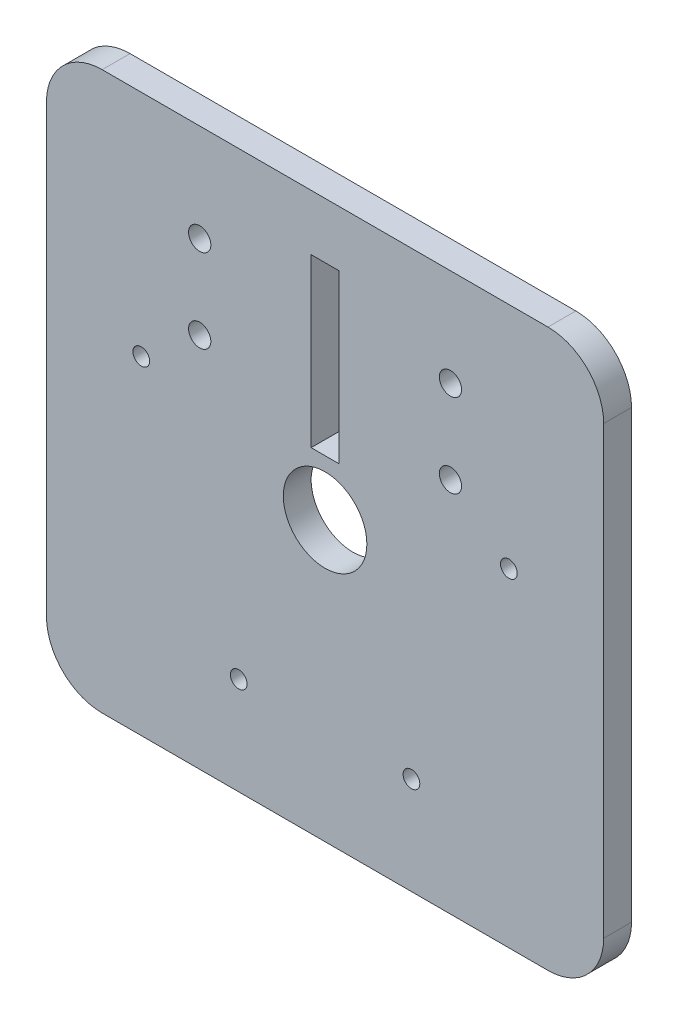
ISO-10303-21;
HEADER;
FILE_DESCRIPTION(('STEP AP214'),'2;1');
FILE_NAME('part.step','',(''),(''),'','','');
FILE_SCHEMA(('AUTOMOTIVE_DESIGN { 1 0 10303 214 1 1 1 1 }'));
ENDSEC;
DATA;
#1=APPLICATION_CONTEXT('core data for automotive mechanical design processes');
#2=APPLICATION_PROTOCOL_DEFINITION('international standard','automotive_design',2000,#1);
#3=PRODUCT_CONTEXT('',#1,'mechanical');
#4=PRODUCT('Part','Part','',(#3));
#5=PRODUCT_RELATED_PRODUCT_CATEGORY('part','',(#4));
#6=PRODUCT_DEFINITION_FORMATION('','',#4);
#7=PRODUCT_DEFINITION_CONTEXT('part definition',#1,'design');
#8=PRODUCT_DEFINITION('design','',#6,#7);
#9=PRODUCT_DEFINITION_SHAPE('','',#8);
#10=(LENGTH_UNIT() NAMED_UNIT(*) SI_UNIT(.MILLI.,.METRE.));
#11=(NAMED_UNIT(*) PLANE_ANGLE_UNIT() SI_UNIT($,.RADIAN.));
#12=(NAMED_UNIT(*) SI_UNIT($,.STERADIAN.) SOLID_ANGLE_UNIT());
#13=UNCERTAINTY_MEASURE_WITH_UNIT(LENGTH_MEASURE(1.E-05),#10,'distance_accuracy_value','');
#14=(GEOMETRIC_REPRESENTATION_CONTEXT(3) GLOBAL_UNCERTAINTY_ASSIGNED_CONTEXT((#13)) GLOBAL_UNIT_ASSIGNED_CONTEXT((#10,
#11,#12)) REPRESENTATION_CONTEXT('',''));
#15=CARTESIAN_POINT('',(0.,0.,0.));
#16=DIRECTION('',(0.,0.,1.));
#17=DIRECTION('',(1.,0.,0.));
#18=AXIS2_PLACEMENT_3D('',#15,#16,#17);
#19=CARTESIAN_POINT('',(0.,0.,5.));
#20=DIRECTION('',(0.,0.,-1.));
#21=DIRECTION('',(-1.,0.,0.));
#22=AXIS2_PLACEMENT_3D('',#19,#20,#21);
#23=PLANE('',#22);
#24=CARTESIAN_POINT('',(-51.2732334160727,-2.68816054430867,5.));
#25=DIRECTION('',(0.,0.,1.));
#26=DIRECTION('',(-1.,0.,0.));
#27=AXIS2_PLACEMENT_3D('',#24,#25,#26);
#28=CIRCLE('',#27,2.);
#29=CARTESIAN_POINT('',(-53.2732334160727,-2.68816054430867,5.));
#30=VERTEX_POINT('',#29);
#31=EDGE_CURVE('E439',#30,#30,#28,.T.);
#32=ORIENTED_EDGE('',*,*,#31,.F.);
#33=EDGE_LOOP('',(#32));
#34=FACE_BOUND('',#33,.T.);
#35=CARTESIAN_POINT('',(-96.2732334160727,-2.68816054430866,5.));
#36=DIRECTION('',(0.,0.,1.));
#37=DIRECTION('',(1.,0.,0.));
#38=AXIS2_PLACEMENT_3D('',#35,#36,#37);
#39=CIRCLE('',#38,2.);
#40=CARTESIAN_POINT('',(-94.2732334160727,-2.68816054430866,5.));
#41=VERTEX_POINT('',#40);
#42=EDGE_CURVE('E445',#41,#41,#39,.T.);
#43=ORIENTED_EDGE('',*,*,#42,.F.);
#44=EDGE_LOOP('',(#43));
#45=FACE_BOUND('',#44,.T.);
#46=CARTESIAN_POINT('',(-96.2732334160727,12.3118394556913,5.));
#47=DIRECTION('',(0.,0.,1.));
#48=DIRECTION('',(-1.,0.,0.));
#49=AXIS2_PLACEMENT_3D('',#46,#47,#48);
#50=CIRCLE('',#49,2.);
#51=CARTESIAN_POINT('',(-98.2732334160727,12.3118394556913,5.));
#52=VERTEX_POINT('',#51);
#53=EDGE_CURVE('E434',#52,#52,#50,.T.);
#54=ORIENTED_EDGE('',*,*,#53,.F.);
#55=EDGE_LOOP('',(#54));
#56=FACE_BOUND('',#55,.T.);
#57=CARTESIAN_POINT('',(-51.2732334160727,12.3118394556913,5.));
#58=DIRECTION('',(0.,0.,1.));
#59=DIRECTION('',(1.,0.,0.));
#60=AXIS2_PLACEMENT_3D('',#57,#58,#59);
#61=CIRCLE('',#60,2.);
#62=CARTESIAN_POINT('',(-49.2732334160727,12.3118394556913,5.));
#63=VERTEX_POINT('',#62);
#64=EDGE_CURVE('E424',#63,#63,#61,.T.);
#65=ORIENTED_EDGE('',*,*,#64,.F.);
#66=EDGE_LOOP('',(#65));
#67=FACE_BOUND('',#66,.T.);
#68=CARTESIAN_POINT('',(-106.757827557717,-11.2516476324012,5.));
#69=DIRECTION('',(0.,0.,-1.));
#70=DIRECTION('',(-1.,0.,0.));
#71=AXIS2_PLACEMENT_3D('',#68,#69,#70);
#72=CIRCLE('',#71,1.5);
#73=CARTESIAN_POINT('',(-108.257827557717,-11.2516476324012,5.));
#74=VERTEX_POINT('',#73);
#75=EDGE_CURVE('E414',#74,#74,#72,.F.);
#76=ORIENTED_EDGE('',*,*,#75,.F.);
#77=EDGE_LOOP('',(#76));
#78=FACE_BOUND('',#77,.T.);
#79=CARTESIAN_POINT('',(-58.2732333952189,-52.6881610045472,5.));
#80=DIRECTION('',(0.,0.,-1.));
#81=DIRECTION('',(-1.,0.,0.));
#82=AXIS2_PLACEMENT_3D('',#79,#80,#81);
#83=CIRCLE('',#82,1.5);
#84=CARTESIAN_POINT('',(-59.7732333952189,-52.6881610045472,5.));
#85=VERTEX_POINT('',#84);
#86=EDGE_CURVE('E407',#85,#85,#83,.F.);
#87=ORIENTED_EDGE('',*,*,#86,.F.);
#88=EDGE_LOOP('',(#87));
#89=FACE_BOUND('',#88,.T.);
#90=CARTESIAN_POINT('',(-89.2732333952189,-52.6881610045472,5.));
#91=DIRECTION('',(0.,0.,-1.));
#92=DIRECTION('',(-1.,0.,0.));
#93=AXIS2_PLACEMENT_3D('',#90,#91,#92);
#94=CIRCLE('',#93,1.5);
#95=CARTESIAN_POINT('',(-90.7732333952189,-52.6881610045472,5.));
#96=VERTEX_POINT('',#95);
#97=EDGE_CURVE('E399',#96,#96,#94,.F.);
#98=ORIENTED_EDGE('',*,*,#97,.F.);
#99=EDGE_LOOP('',(#98));
#100=FACE_BOUND('',#99,.T.);
#101=CARTESIAN_POINT('',(-40.7886392327205,-11.2516476324012,5.));
#102=DIRECTION('',(0.,0.,-1.));
#103=DIRECTION('',(-1.,0.,0.));
#104=AXIS2_PLACEMENT_3D('',#101,#102,#103);
#105=CIRCLE('',#104,1.50000000627285);
#106=CARTESIAN_POINT('',(-42.2886392389934,-11.2516476324012,5.));
#107=VERTEX_POINT('',#106);
#108=EDGE_CURVE('E394',#107,#107,#105,.F.);
#109=ORIENTED_EDGE('',*,*,#108,.F.);
#110=EDGE_LOOP('',(#109));
#111=FACE_BOUND('',#110,.T.);
#112=DIRECTION('',(1.,0.,0.));
#113=VECTOR('',#112,1.);
#114=CARTESIAN_POINT('',(-123.773233416073,-70.1881605443087,5.));
#115=LINE('',#114,#113);
#116=CARTESIAN_POINT('',(-113.773233416073,-70.1881605443087,5.));
#117=VERTEX_POINT('',#116);
#118=CARTESIAN_POINT('',(-33.7732334160727,-70.1881605443087,5.));
#119=VERTEX_POINT('',#118);
#120=EDGE_CURVE('E174',#117,#119,#115,.T.);
#121=ORIENTED_EDGE('',*,*,#120,.T.);
#122=CARTESIAN_POINT('',(-33.7732334160727,-60.1881605443087,5.));
#123=DIRECTION('',(0.,0.,-1.));
#124=DIRECTION('',(-1.,0.,0.));
#125=AXIS2_PLACEMENT_3D('',#122,#123,#124);
#126=CIRCLE('',#125,10.);
#127=CARTESIAN_POINT('',(-23.7732334160727,-60.1881605443087,5.));
#128=VERTEX_POINT('',#127);
#129=EDGE_CURVE('E212',#119,#128,#126,.F.);
#130=ORIENTED_EDGE('',*,*,#129,.T.);
#131=DIRECTION('',(0.,1.,0.));
#132=VECTOR('',#131,1.);
#133=CARTESIAN_POINT('',(-23.7732334160727,29.8118394556913,5.));
#134=LINE('',#133,#132);
#135=CARTESIAN_POINT('',(-23.7732334160727,19.8118394556913,5.));
#136=VERTEX_POINT('',#135);
#137=EDGE_CURVE('E177',#128,#136,#134,.T.);
#138=ORIENTED_EDGE('',*,*,#137,.T.);
#139=CARTESIAN_POINT('',(-33.7732334160727,19.8118394556913,5.));
#140=DIRECTION('',(0.,0.,-1.));
#141=DIRECTION('',(-1.,0.,0.));
#142=AXIS2_PLACEMENT_3D('',#139,#140,#141);
#143=CIRCLE('',#142,10.);
#144=CARTESIAN_POINT('',(-33.7732334160727,29.8118394556913,5.));
#145=VERTEX_POINT('',#144);
#146=EDGE_CURVE('E208',#136,#145,#143,.F.);
#147=ORIENTED_EDGE('',*,*,#146,.T.);
#148=DIRECTION('',(-1.,0.,0.));
#149=VECTOR('',#148,1.);
#150=CARTESIAN_POINT('',(-123.773233416073,29.8118394556913,5.));
#151=LINE('',#150,#149);
#152=CARTESIAN_POINT('',(-113.773233416073,29.8118394556913,5.));
#153=VERTEX_POINT('',#152);
#154=EDGE_CURVE('E169',#145,#153,#151,.T.);
#155=ORIENTED_EDGE('',*,*,#154,.T.);
#156=CARTESIAN_POINT('',(-113.773233416073,19.8118394556913,5.));
#157=DIRECTION('',(0.,0.,-1.));
#158=DIRECTION('',(-1.,0.,0.));
#159=AXIS2_PLACEMENT_3D('',#156,#157,#158);
#160=CIRCLE('',#159,10.);
#161=CARTESIAN_POINT('',(-123.773233416073,19.8118394556913,5.));
#162=VERTEX_POINT('',#161);
#163=EDGE_CURVE('E55',#153,#162,#160,.F.);
#164=ORIENTED_EDGE('',*,*,#163,.T.);
#165=DIRECTION('',(0.,-1.,0.));
#166=VECTOR('',#165,1.);
#167=CARTESIAN_POINT('',(-123.773233416073,29.8118394556913,5.));
#168=LINE('',#167,#166);
#169=CARTESIAN_POINT('',(-123.773233416073,-60.1881605443087,5.));
#170=VERTEX_POINT('',#169);
#171=EDGE_CURVE('E171',#162,#170,#168,.T.);
#172=ORIENTED_EDGE('',*,*,#171,.T.);
#173=CARTESIAN_POINT('',(-113.773233416073,-60.1881605443087,5.));
#174=DIRECTION('',(0.,0.,-1.));
#175=DIRECTION('',(-1.,0.,0.));
#176=AXIS2_PLACEMENT_3D('',#173,#174,#175);
#177=CIRCLE('',#176,10.);
#178=EDGE_CURVE('E210',#170,#117,#177,.F.);
#179=ORIENTED_EDGE('',*,*,#178,.T.);
#180=EDGE_LOOP('',(#121,#130,#138,#147,#155,#164,#172,#179));
#181=FACE_BOUND('',#180,.T.);
#182=DIRECTION('',(0.,-1.,0.));
#183=VECTOR('',#182,1.);
#184=CARTESIAN_POINT('',(-76.2732334160727,19.8118394556913,5.));
#185=LINE('',#184,#183);
#186=CARTESIAN_POINT('',(-76.2732334160727,19.8118394556913,5.));
#187=VERTEX_POINT('',#186);
#188=CARTESIAN_POINT('',(-76.2732334160727,-10.1881605443087,5.));
#189=VERTEX_POINT('',#188);
#190=EDGE_CURVE('E125',#187,#189,#185,.T.);
#191=ORIENTED_EDGE('',*,*,#190,.F.);
#192=DIRECTION('',(-1.,0.,0.));
#193=VECTOR('',#192,1.);
#194=CARTESIAN_POINT('',(-76.2732334160727,19.8118394556913,5.));
#195=LINE('',#194,#193);
#196=CARTESIAN_POINT('',(-71.2732334160727,19.8118394556913,5.));
#197=VERTEX_POINT('',#196);
#198=EDGE_CURVE('E151',#197,#187,#195,.T.);
#199=ORIENTED_EDGE('',*,*,#198,.F.);
#200=DIRECTION('',(0.,1.,0.));
#201=VECTOR('',#200,1.);
#202=CARTESIAN_POINT('',(-71.2732334160727,19.8118394556913,5.));
#203=LINE('',#202,#201);
#204=CARTESIAN_POINT('',(-71.2732334160727,-10.1881605443087,5.));
#205=VERTEX_POINT('',#204);
#206=EDGE_CURVE('E149',#205,#197,#203,.T.);
#207=ORIENTED_EDGE('',*,*,#206,.F.);
#208=DIRECTION('',(1.,0.,0.));
#209=VECTOR('',#208,1.);
#210=CARTESIAN_POINT('',(-76.2732334160727,-10.1881605443087,5.));
#211=LINE('',#210,#209);
#212=EDGE_CURVE('E135',#189,#205,#211,.T.);
#213=ORIENTED_EDGE('',*,*,#212,.F.);
#214=EDGE_LOOP('',(#191,#199,#207,#213));
#215=FACE_BOUND('',#214,.T.);
#216=CARTESIAN_POINT('',(-73.7732334160727,-20.1881605443087,5.));
#217=DIRECTION('',(0.,0.,1.));
#218=DIRECTION('',(1.,0.,0.));
#219=AXIS2_PLACEMENT_3D('',#216,#217,#218);
#220=CIRCLE('',#219,7.50000000000001);
#221=CARTESIAN_POINT('',(-66.2732334160727,-20.1881605443087,5.));
#222=VERTEX_POINT('',#221);
#223=EDGE_CURVE('E158',#222,#222,#220,.T.);
#224=ORIENTED_EDGE('',*,*,#223,.F.);
#225=EDGE_LOOP('',(#224));
#226=FACE_BOUND('',#225,.T.);
#227=ADVANCED_FACE('F33',(#34,#45,#56,#67,#78,#89,#100,#111,#181,#215,#226),#23,.F.);
#228=CARTESIAN_POINT('',(0.,0.,0.));
#229=DIRECTION('',(0.,0.,-1.));
#230=DIRECTION('',(-1.,0.,0.));
#231=AXIS2_PLACEMENT_3D('',#228,#229,#230);
#232=PLANE('',#231);
#233=CARTESIAN_POINT('',(-51.2732334160727,-2.68816054430867,0.));
#234=DIRECTION('',(0.,0.,-1.));
#235=DIRECTION('',(-1.,0.,0.));
#236=AXIS2_PLACEMENT_3D('',#233,#234,#235);
#237=CIRCLE('',#236,2.);
#238=CARTESIAN_POINT('',(-53.2732334160727,-2.68816054430867,0.));
#239=VERTEX_POINT('',#238);
#240=EDGE_CURVE('E436',#239,#239,#237,.F.);
#241=ORIENTED_EDGE('',*,*,#240,.T.);
#242=EDGE_LOOP('',(#241));
#243=FACE_BOUND('',#242,.T.);
#244=CARTESIAN_POINT('',(-96.2732334160727,-2.68816054430866,0.));
#245=DIRECTION('',(0.,0.,-1.));
#246=DIRECTION('',(-1.,0.,0.));
#247=AXIS2_PLACEMENT_3D('',#244,#245,#246);
#248=CIRCLE('',#247,2.);
#249=CARTESIAN_POINT('',(-98.2732334160727,-2.68816054430866,0.));
#250=VERTEX_POINT('',#249);
#251=EDGE_CURVE('E442',#250,#250,#248,.F.);
#252=ORIENTED_EDGE('',*,*,#251,.T.);
#253=EDGE_LOOP('',(#252));
#254=FACE_BOUND('',#253,.T.);
#255=CARTESIAN_POINT('',(-96.2732334160727,12.3118394556913,0.));
#256=DIRECTION('',(0.,0.,-1.));
#257=DIRECTION('',(-1.,0.,0.));
#258=AXIS2_PLACEMENT_3D('',#255,#256,#257);
#259=CIRCLE('',#258,2.);
#260=CARTESIAN_POINT('',(-98.2732334160727,12.3118394556913,0.));
#261=VERTEX_POINT('',#260);
#262=EDGE_CURVE('E448',#261,#261,#259,.F.);
#263=ORIENTED_EDGE('',*,*,#262,.T.);
#264=EDGE_LOOP('',(#263));
#265=FACE_BOUND('',#264,.T.);
#266=CARTESIAN_POINT('',(-51.2732334160727,12.3118394556913,0.));
#267=DIRECTION('',(0.,0.,-1.));
#268=DIRECTION('',(-1.,0.,0.));
#269=AXIS2_PLACEMENT_3D('',#266,#267,#268);
#270=CIRCLE('',#269,2.);
#271=CARTESIAN_POINT('',(-53.2732334160727,12.3118394556913,0.));
#272=VERTEX_POINT('',#271);
#273=EDGE_CURVE('E429',#272,#272,#270,.F.);
#274=ORIENTED_EDGE('',*,*,#273,.T.);
#275=EDGE_LOOP('',(#274));
#276=FACE_BOUND('',#275,.T.);
#277=CARTESIAN_POINT('',(-106.757827557717,-11.2516476324012,0.));
#278=DIRECTION('',(0.,0.,-1.));
#279=DIRECTION('',(-1.,0.,0.));
#280=AXIS2_PLACEMENT_3D('',#277,#278,#279);
#281=CIRCLE('',#280,1.5);
#282=CARTESIAN_POINT('',(-108.257827557717,-11.2516476324012,0.));
#283=VERTEX_POINT('',#282);
#284=EDGE_CURVE('E401',#283,#283,#281,.T.);
#285=ORIENTED_EDGE('',*,*,#284,.F.);
#286=EDGE_LOOP('',(#285));
#287=FACE_BOUND('',#286,.T.);
#288=CARTESIAN_POINT('',(-58.2732333952189,-52.6881610045472,0.));
#289=DIRECTION('',(0.,0.,-1.));
#290=DIRECTION('',(-1.,0.,0.));
#291=AXIS2_PLACEMENT_3D('',#288,#289,#290);
#292=CIRCLE('',#291,1.5);
#293=CARTESIAN_POINT('',(-59.7732333952189,-52.6881610045472,0.));
#294=VERTEX_POINT('',#293);
#295=EDGE_CURVE('E422',#294,#294,#292,.T.);
#296=ORIENTED_EDGE('',*,*,#295,.F.);
#297=EDGE_LOOP('',(#296));
#298=FACE_BOUND('',#297,.T.);
#299=CARTESIAN_POINT('',(-89.2732333952189,-52.6881610045472,0.));
#300=DIRECTION('',(0.,0.,-1.));
#301=DIRECTION('',(-1.,0.,0.));
#302=AXIS2_PLACEMENT_3D('',#299,#300,#301);
#303=CIRCLE('',#302,1.5);
#304=CARTESIAN_POINT('',(-90.7732333952189,-52.6881610045472,0.));
#305=VERTEX_POINT('',#304);
#306=EDGE_CURVE('E404',#305,#305,#303,.T.);
#307=ORIENTED_EDGE('',*,*,#306,.F.);
#308=EDGE_LOOP('',(#307));
#309=FACE_BOUND('',#308,.T.);
#310=CARTESIAN_POINT('',(-40.7886392327205,-11.2516476324012,0.));
#311=DIRECTION('',(0.,0.,-1.));
#312=DIRECTION('',(-1.,0.,0.));
#313=AXIS2_PLACEMENT_3D('',#310,#311,#312);
#314=CIRCLE('',#313,1.50000000627285);
#315=CARTESIAN_POINT('',(-42.2886392389934,-11.2516476324012,0.));
#316=VERTEX_POINT('',#315);
#317=EDGE_CURVE('E397',#316,#316,#314,.T.);
#318=ORIENTED_EDGE('',*,*,#317,.F.);
#319=EDGE_LOOP('',(#318));
#320=FACE_BOUND('',#319,.T.);
#321=DIRECTION('',(-1.,0.,0.));
#322=VECTOR('',#321,1.);
#323=CARTESIAN_POINT('',(-76.2732334160727,19.8118394556913,0.));
#324=LINE('',#323,#322);
#325=CARTESIAN_POINT('',(-71.2732334160727,19.8118394556913,0.));
#326=VERTEX_POINT('',#325);
#327=CARTESIAN_POINT('',(-76.2732334160727,19.8118394556913,0.));
#328=VERTEX_POINT('',#327);
#329=EDGE_CURVE('E136',#326,#328,#324,.T.);
#330=ORIENTED_EDGE('',*,*,#329,.T.);
#331=DIRECTION('',(0.,-1.,0.));
#332=VECTOR('',#331,1.);
#333=CARTESIAN_POINT('',(-76.2732334160727,19.8118394556913,0.));
#334=LINE('',#333,#332);
#335=CARTESIAN_POINT('',(-76.2732334160727,-10.1881605443087,0.));
#336=VERTEX_POINT('',#335);
#337=EDGE_CURVE('E156',#328,#336,#334,.T.);
#338=ORIENTED_EDGE('',*,*,#337,.T.);
#339=DIRECTION('',(1.,0.,0.));
#340=VECTOR('',#339,1.);
#341=CARTESIAN_POINT('',(-76.2732334160727,-10.1881605443087,0.));
#342=LINE('',#341,#340);
#343=CARTESIAN_POINT('',(-71.2732334160727,-10.1881605443087,0.));
#344=VERTEX_POINT('',#343);
#345=EDGE_CURVE('E142',#336,#344,#342,.T.);
#346=ORIENTED_EDGE('',*,*,#345,.T.);
#347=DIRECTION('',(0.,1.,0.));
#348=VECTOR('',#347,1.);
#349=CARTESIAN_POINT('',(-71.2732334160727,19.8118394556913,0.));
#350=LINE('',#349,#348);
#351=EDGE_CURVE('E160',#344,#326,#350,.T.);
#352=ORIENTED_EDGE('',*,*,#351,.T.);
#353=EDGE_LOOP('',(#330,#338,#346,#352));
#354=FACE_BOUND('',#353,.T.);
#355=DIRECTION('',(0.,1.,0.));
#356=VECTOR('',#355,1.);
#357=CARTESIAN_POINT('',(-23.7732334160727,29.8118394556913,0.));
#358=LINE('',#357,#356);
#359=CARTESIAN_POINT('',(-23.7732334160727,-60.1881605443087,0.));
#360=VERTEX_POINT('',#359);
#361=CARTESIAN_POINT('',(-23.7732334160727,19.8118394556913,0.));
#362=VERTEX_POINT('',#361);
#363=EDGE_CURVE('E172',#360,#362,#358,.T.);
#364=ORIENTED_EDGE('',*,*,#363,.F.);
#365=CARTESIAN_POINT('',(-33.7732334160727,-60.1881605443087,0.));
#366=DIRECTION('',(0.,0.,-1.));
#367=DIRECTION('',(-1.,0.,0.));
#368=AXIS2_PLACEMENT_3D('',#365,#366,#367);
#369=CIRCLE('',#368,10.);
#370=CARTESIAN_POINT('',(-33.7732334160727,-70.1881605443087,0.));
#371=VERTEX_POINT('',#370);
#372=EDGE_CURVE('E200',#360,#371,#369,.T.);
#373=ORIENTED_EDGE('',*,*,#372,.T.);
#374=DIRECTION('',(1.,0.,0.));
#375=VECTOR('',#374,1.);
#376=CARTESIAN_POINT('',(-123.773233416073,-70.1881605443087,0.));
#377=LINE('',#376,#375);
#378=CARTESIAN_POINT('',(-113.773233416073,-70.1881605443087,0.));
#379=VERTEX_POINT('',#378);
#380=EDGE_CURVE('E185',#379,#371,#377,.T.);
#381=ORIENTED_EDGE('',*,*,#380,.F.);
#382=CARTESIAN_POINT('',(-113.773233416073,-60.1881605443087,0.));
#383=DIRECTION('',(0.,0.,-1.));
#384=DIRECTION('',(-1.,0.,0.));
#385=AXIS2_PLACEMENT_3D('',#382,#383,#384);
#386=CIRCLE('',#385,10.);
#387=CARTESIAN_POINT('',(-123.773233416073,-60.1881605443087,0.));
#388=VERTEX_POINT('',#387);
#389=EDGE_CURVE('E198',#379,#388,#386,.T.);
#390=ORIENTED_EDGE('',*,*,#389,.T.);
#391=DIRECTION('',(0.,-1.,0.));
#392=VECTOR('',#391,1.);
#393=CARTESIAN_POINT('',(-123.773233416073,29.8118394556913,0.));
#394=LINE('',#393,#392);
#395=CARTESIAN_POINT('',(-123.773233416073,19.8118394556913,0.));
#396=VERTEX_POINT('',#395);
#397=EDGE_CURVE('E183',#396,#388,#394,.T.);
#398=ORIENTED_EDGE('',*,*,#397,.F.);
#399=CARTESIAN_POINT('',(-113.773233416073,19.8118394556913,0.));
#400=DIRECTION('',(0.,0.,-1.));
#401=DIRECTION('',(-1.,0.,0.));
#402=AXIS2_PLACEMENT_3D('',#399,#400,#401);
#403=CIRCLE('',#402,10.);
#404=CARTESIAN_POINT('',(-113.773233416073,29.8118394556913,0.));
#405=VERTEX_POINT('',#404);
#406=EDGE_CURVE('E194',#396,#405,#403,.T.);
#407=ORIENTED_EDGE('',*,*,#406,.T.);
#408=DIRECTION('',(-1.,0.,0.));
#409=VECTOR('',#408,1.);
#410=CARTESIAN_POINT('',(-123.773233416073,29.8118394556913,0.));
#411=LINE('',#410,#409);
#412=CARTESIAN_POINT('',(-33.7732334160727,29.8118394556913,0.));
#413=VERTEX_POINT('',#412);
#414=EDGE_CURVE('E143',#413,#405,#411,.T.);
#415=ORIENTED_EDGE('',*,*,#414,.F.);
#416=CARTESIAN_POINT('',(-33.7732334160727,19.8118394556913,0.));
#417=DIRECTION('',(0.,0.,-1.));
#418=DIRECTION('',(-1.,0.,0.));
#419=AXIS2_PLACEMENT_3D('',#416,#417,#418);
#420=CIRCLE('',#419,10.);
#421=EDGE_CURVE('E196',#413,#362,#420,.T.);
#422=ORIENTED_EDGE('',*,*,#421,.T.);
#423=EDGE_LOOP('',(#364,#373,#381,#390,#398,#407,#415,#422));
#424=FACE_BOUND('',#423,.T.);
#425=CARTESIAN_POINT('',(-73.7732334160727,-20.1881605443087,0.));
#426=DIRECTION('',(0.,0.,1.));
#427=DIRECTION('',(1.,0.,0.));
#428=AXIS2_PLACEMENT_3D('',#425,#426,#427);
#429=CIRCLE('',#428,7.50000000000001);
#430=CARTESIAN_POINT('',(-66.2732334160727,-20.1881605443087,0.));
#431=VERTEX_POINT('',#430);
#432=EDGE_CURVE('E412',#431,#431,#429,.T.);
#433=ORIENTED_EDGE('',*,*,#432,.T.);
#434=EDGE_LOOP('',(#433));
#435=FACE_BOUND('',#434,.T.);
#436=ADVANCED_FACE('F230',(#243,#254,#265,#276,#287,#298,#309,#320,#354,#424,#435),#232,.T.);
#437=CARTESIAN_POINT('',(-123.773233416073,29.8118394556913,5.));
#438=DIRECTION('',(0.,-1.,0.));
#439=DIRECTION('',(1.,0.,0.));
#440=AXIS2_PLACEMENT_3D('',#437,#438,#439);
#441=PLANE('',#440);
#442=ORIENTED_EDGE('',*,*,#154,.F.);
#443=DIRECTION('',(0.,0.,-1.));
#444=VECTOR('',#443,1.);
#445=CARTESIAN_POINT('',(-33.7732334160727,29.8118394556913,5.));
#446=LINE('',#445,#444);
#447=EDGE_CURVE('E11',#145,#413,#446,.T.);
#448=ORIENTED_EDGE('',*,*,#447,.T.);
#449=ORIENTED_EDGE('',*,*,#414,.T.);
#450=DIRECTION('',(0.,0.,-1.));
#451=VECTOR('',#450,1.);
#452=CARTESIAN_POINT('',(-113.773233416073,29.8118394556913,5.));
#453=LINE('',#452,#451);
#454=EDGE_CURVE('E41',#405,#153,#453,.F.);
#455=ORIENTED_EDGE('',*,*,#454,.T.);
#456=EDGE_LOOP('',(#442,#448,#449,#455));
#457=FACE_BOUND('',#456,.T.);
#458=ADVANCED_FACE('F220',(#457),#441,.F.);
#459=CARTESIAN_POINT('',(-123.773233416073,29.8118394556913,5.));
#460=DIRECTION('',(1.,0.,0.));
#461=DIRECTION('',(0.,0.,-1.));
#462=AXIS2_PLACEMENT_3D('',#459,#460,#461);
#463=PLANE('',#462);
#464=ORIENTED_EDGE('',*,*,#397,.T.);
#465=DIRECTION('',(0.,0.,-1.));
#466=VECTOR('',#465,1.);
#467=CARTESIAN_POINT('',(-123.773233416073,-60.1881605443087,5.));
#468=LINE('',#467,#466);
#469=EDGE_CURVE('E48',#388,#170,#468,.F.);
#470=ORIENTED_EDGE('',*,*,#469,.T.);
#471=ORIENTED_EDGE('',*,*,#171,.F.);
#472=DIRECTION('',(0.,0.,-1.));
#473=VECTOR('',#472,1.);
#474=CARTESIAN_POINT('',(-123.773233416073,19.8118394556913,5.));
#475=LINE('',#474,#473);
#476=EDGE_CURVE('E214',#162,#396,#475,.T.);
#477=ORIENTED_EDGE('',*,*,#476,.T.);
#478=EDGE_LOOP('',(#464,#470,#471,#477));
#479=FACE_BOUND('',#478,.T.);
#480=ADVANCED_FACE('F227',(#479),#463,.F.);
#481=CARTESIAN_POINT('',(-123.773233416073,-70.1881605443087,5.));
#482=DIRECTION('',(0.,1.,0.));
#483=DIRECTION('',(-1.,0.,0.));
#484=AXIS2_PLACEMENT_3D('',#481,#482,#483);
#485=PLANE('',#484);
#486=ORIENTED_EDGE('',*,*,#380,.T.);
#487=DIRECTION('',(0.,0.,-1.));
#488=VECTOR('',#487,1.);
#489=CARTESIAN_POINT('',(-33.7732334160727,-70.1881605443087,5.));
#490=LINE('',#489,#488);
#491=EDGE_CURVE('E205',#371,#119,#490,.F.);
#492=ORIENTED_EDGE('',*,*,#491,.T.);
#493=ORIENTED_EDGE('',*,*,#120,.F.);
#494=DIRECTION('',(0.,0.,-1.));
#495=VECTOR('',#494,1.);
#496=CARTESIAN_POINT('',(-113.773233416073,-70.1881605443087,5.));
#497=LINE('',#496,#495);
#498=EDGE_CURVE('E202',#117,#379,#497,.T.);
#499=ORIENTED_EDGE('',*,*,#498,.T.);
#500=EDGE_LOOP('',(#486,#492,#493,#499));
#501=FACE_BOUND('',#500,.T.);
#502=ADVANCED_FACE('F239',(#501),#485,.F.);
#503=CARTESIAN_POINT('',(-23.7732334160727,29.8118394556913,5.));
#504=DIRECTION('',(-1.,0.,0.));
#505=DIRECTION('',(0.,-1.,0.));
#506=AXIS2_PLACEMENT_3D('',#503,#504,#505);
#507=PLANE('',#506);
#508=ORIENTED_EDGE('',*,*,#137,.F.);
#509=DIRECTION('',(0.,0.,-1.));
#510=VECTOR('',#509,1.);
#511=CARTESIAN_POINT('',(-23.7732334160727,-60.1881605443087,5.));
#512=LINE('',#511,#510);
#513=EDGE_CURVE('E191',#128,#360,#512,.T.);
#514=ORIENTED_EDGE('',*,*,#513,.T.);
#515=ORIENTED_EDGE('',*,*,#363,.T.);
#516=DIRECTION('',(0.,0.,-1.));
#517=VECTOR('',#516,1.);
#518=CARTESIAN_POINT('',(-23.7732334160727,19.8118394556913,5.));
#519=LINE('',#518,#517);
#520=EDGE_CURVE('E180',#362,#136,#519,.F.);
#521=ORIENTED_EDGE('',*,*,#520,.T.);
#522=EDGE_LOOP('',(#508,#514,#515,#521));
#523=FACE_BOUND('',#522,.T.);
#524=ADVANCED_FACE('F247',(#523),#507,.F.);
#525=CARTESIAN_POINT('',(-76.2732334160727,19.8118394556913,5.));
#526=DIRECTION('',(1.,0.,0.));
#527=DIRECTION('',(0.,0.,-1.));
#528=AXIS2_PLACEMENT_3D('',#525,#526,#527);
#529=PLANE('',#528);
#530=ORIENTED_EDGE('',*,*,#337,.F.);
#531=DIRECTION('',(0.,0.,-1.));
#532=VECTOR('',#531,1.);
#533=CARTESIAN_POINT('',(-76.2732334160727,19.8118394556913,5.));
#534=LINE('',#533,#532);
#535=EDGE_CURVE('E131',#187,#328,#534,.T.);
#536=ORIENTED_EDGE('',*,*,#535,.F.);
#537=ORIENTED_EDGE('',*,*,#190,.T.);
#538=DIRECTION('',(0.,0.,-1.));
#539=VECTOR('',#538,1.);
#540=CARTESIAN_POINT('',(-76.2732334160727,-10.1881605443087,5.));
#541=LINE('',#540,#539);
#542=EDGE_CURVE('E128',#189,#336,#541,.T.);
#543=ORIENTED_EDGE('',*,*,#542,.T.);
#544=EDGE_LOOP('',(#530,#536,#537,#543));
#545=FACE_BOUND('',#544,.T.);
#546=ADVANCED_FACE('F127',(#545),#529,.T.);
#547=CARTESIAN_POINT('',(-76.2732334160727,-10.1881605443087,5.));
#548=DIRECTION('',(0.,1.,0.));
#549=DIRECTION('',(0.,0.,1.));
#550=AXIS2_PLACEMENT_3D('',#547,#548,#549);
#551=PLANE('',#550);
#552=ORIENTED_EDGE('',*,*,#345,.F.);
#553=ORIENTED_EDGE('',*,*,#542,.F.);
#554=ORIENTED_EDGE('',*,*,#212,.T.);
#555=DIRECTION('',(0.,0.,-1.));
#556=VECTOR('',#555,1.);
#557=CARTESIAN_POINT('',(-71.2732334160727,-10.1881605443087,5.));
#558=LINE('',#557,#556);
#559=EDGE_CURVE('E144',#205,#344,#558,.T.);
#560=ORIENTED_EDGE('',*,*,#559,.T.);
#561=EDGE_LOOP('',(#552,#553,#554,#560));
#562=FACE_BOUND('',#561,.T.);
#563=ADVANCED_FACE('F139',(#562),#551,.T.);
#564=CARTESIAN_POINT('',(-71.2732334160727,19.8118394556913,5.));
#565=DIRECTION('',(-1.,0.,0.));
#566=DIRECTION('',(0.,-1.,0.));
#567=AXIS2_PLACEMENT_3D('',#564,#565,#566);
#568=PLANE('',#567);
#569=ORIENTED_EDGE('',*,*,#351,.F.);
#570=ORIENTED_EDGE('',*,*,#559,.F.);
#571=ORIENTED_EDGE('',*,*,#206,.T.);
#572=DIRECTION('',(0.,0.,-1.));
#573=VECTOR('',#572,1.);
#574=CARTESIAN_POINT('',(-71.2732334160727,19.8118394556913,5.));
#575=LINE('',#574,#573);
#576=EDGE_CURVE('E166',#197,#326,#575,.T.);
#577=ORIENTED_EDGE('',*,*,#576,.T.);
#578=EDGE_LOOP('',(#569,#570,#571,#577));
#579=FACE_BOUND('',#578,.T.);
#580=ADVANCED_FACE('F290',(#579),#568,.T.);
#581=CARTESIAN_POINT('',(-76.2732334160727,19.8118394556913,5.));
#582=DIRECTION('',(0.,-1.,0.));
#583=DIRECTION('',(0.,0.,-1.));
#584=AXIS2_PLACEMENT_3D('',#581,#582,#583);
#585=PLANE('',#584);
#586=ORIENTED_EDGE('',*,*,#329,.F.);
#587=ORIENTED_EDGE('',*,*,#576,.F.);
#588=ORIENTED_EDGE('',*,*,#198,.T.);
#589=ORIENTED_EDGE('',*,*,#535,.T.);
#590=EDGE_LOOP('',(#586,#587,#588,#589));
#591=FACE_BOUND('',#590,.T.);
#592=ADVANCED_FACE('F284',(#591),#585,.T.);
#593=CARTESIAN_POINT('',(-73.7732334160727,-20.1881605443087,5.));
#594=DIRECTION('',(0.,0.,-1.));
#595=DIRECTION('',(-1.,0.,0.));
#596=AXIS2_PLACEMENT_3D('',#593,#594,#595);
#597=CYLINDRICAL_SURFACE('',#596,7.50000000000001);
#598=ORIENTED_EDGE('',*,*,#223,.T.);
#599=EDGE_LOOP('',(#598));
#600=FACE_BOUND('',#599,.T.);
#601=ORIENTED_EDGE('',*,*,#432,.F.);
#602=EDGE_LOOP('',(#601));
#603=FACE_BOUND('',#602,.T.);
#604=ADVANCED_FACE('F280',(#600,#603),#597,.F.);
#605=CARTESIAN_POINT('',(-33.7732334160727,-60.1881605443087,5.));
#606=DIRECTION('',(0.,0.,-1.));
#607=DIRECTION('',(-1.,0.,0.));
#608=AXIS2_PLACEMENT_3D('',#605,#606,#607);
#609=CYLINDRICAL_SURFACE('',#608,10.);
#610=ORIENTED_EDGE('',*,*,#129,.F.);
#611=ORIENTED_EDGE('',*,*,#491,.F.);
#612=ORIENTED_EDGE('',*,*,#372,.F.);
#613=ORIENTED_EDGE('',*,*,#513,.F.);
#614=EDGE_LOOP('',(#610,#611,#612,#613));
#615=FACE_BOUND('',#614,.T.);
#616=ADVANCED_FACE('F245',(#615),#609,.T.);
#617=CARTESIAN_POINT('',(-113.773233416073,-60.1881605443087,5.));
#618=DIRECTION('',(0.,0.,-1.));
#619=DIRECTION('',(-1.,0.,0.));
#620=AXIS2_PLACEMENT_3D('',#617,#618,#619);
#621=CYLINDRICAL_SURFACE('',#620,10.);
#622=ORIENTED_EDGE('',*,*,#178,.F.);
#623=ORIENTED_EDGE('',*,*,#469,.F.);
#624=ORIENTED_EDGE('',*,*,#389,.F.);
#625=ORIENTED_EDGE('',*,*,#498,.F.);
#626=EDGE_LOOP('',(#622,#623,#624,#625));
#627=FACE_BOUND('',#626,.T.);
#628=ADVANCED_FACE('F236',(#627),#621,.T.);
#629=CARTESIAN_POINT('',(-33.7732334160727,19.8118394556913,5.));
#630=DIRECTION('',(0.,0.,-1.));
#631=DIRECTION('',(-1.,0.,0.));
#632=AXIS2_PLACEMENT_3D('',#629,#630,#631);
#633=CYLINDRICAL_SURFACE('',#632,10.);
#634=ORIENTED_EDGE('',*,*,#146,.F.);
#635=ORIENTED_EDGE('',*,*,#520,.F.);
#636=ORIENTED_EDGE('',*,*,#421,.F.);
#637=ORIENTED_EDGE('',*,*,#447,.F.);
#638=EDGE_LOOP('',(#634,#635,#636,#637));
#639=FACE_BOUND('',#638,.T.);
#640=ADVANCED_FACE('F250',(#639),#633,.T.);
#641=CARTESIAN_POINT('',(-113.773233416073,19.8118394556913,5.));
#642=DIRECTION('',(0.,0.,-1.));
#643=DIRECTION('',(-1.,0.,0.));
#644=AXIS2_PLACEMENT_3D('',#641,#642,#643);
#645=CYLINDRICAL_SURFACE('',#644,10.);
#646=ORIENTED_EDGE('',*,*,#163,.F.);
#647=ORIENTED_EDGE('',*,*,#454,.F.);
#648=ORIENTED_EDGE('',*,*,#406,.F.);
#649=ORIENTED_EDGE('',*,*,#476,.F.);
#650=EDGE_LOOP('',(#646,#647,#648,#649));
#651=FACE_BOUND('',#650,.T.);
#652=ADVANCED_FACE('F35',(#651),#645,.T.);
#653=CARTESIAN_POINT('',(-40.7886392327205,-11.2516476324012,9.24264070486158));
#654=DIRECTION('',(0.,0.,-1.));
#655=DIRECTION('',(-1.,0.,0.));
#656=AXIS2_PLACEMENT_3D('',#653,#654,#655);
#657=CYLINDRICAL_SURFACE('',#656,1.50000000627285);
#658=ORIENTED_EDGE('',*,*,#108,.T.);
#659=EDGE_LOOP('',(#658));
#660=FACE_BOUND('',#659,.T.);
#661=ORIENTED_EDGE('',*,*,#317,.T.);
#662=EDGE_LOOP('',(#661));
#663=FACE_BOUND('',#662,.T.);
#664=ADVANCED_FACE('F256',(#660,#663),#657,.F.);
#665=CARTESIAN_POINT('',(-89.2732333952189,-52.6881610045472,9.24264070486158));
#666=DIRECTION('',(0.,0.,-1.));
#667=DIRECTION('',(-1.,0.,0.));
#668=AXIS2_PLACEMENT_3D('',#665,#666,#667);
#669=CYLINDRICAL_SURFACE('',#668,1.5);
#670=ORIENTED_EDGE('',*,*,#97,.T.);
#671=EDGE_LOOP('',(#670));
#672=FACE_BOUND('',#671,.T.);
#673=ORIENTED_EDGE('',*,*,#306,.T.);
#674=EDGE_LOOP('',(#673));
#675=FACE_BOUND('',#674,.T.);
#676=ADVANCED_FACE('F296',(#672,#675),#669,.F.);
#677=CARTESIAN_POINT('',(-58.2732333952189,-52.6881610045472,9.24264070486158));
#678=DIRECTION('',(0.,0.,-1.));
#679=DIRECTION('',(-1.,0.,0.));
#680=AXIS2_PLACEMENT_3D('',#677,#678,#679);
#681=CYLINDRICAL_SURFACE('',#680,1.5);
#682=ORIENTED_EDGE('',*,*,#86,.T.);
#683=EDGE_LOOP('',(#682));
#684=FACE_BOUND('',#683,.T.);
#685=ORIENTED_EDGE('',*,*,#295,.T.);
#686=EDGE_LOOP('',(#685));
#687=FACE_BOUND('',#686,.T.);
#688=ADVANCED_FACE('F381',(#684,#687),#681,.F.);
#689=CARTESIAN_POINT('',(-106.757827557717,-11.2516476324012,9.24264070486158));
#690=DIRECTION('',(0.,0.,-1.));
#691=DIRECTION('',(-1.,0.,0.));
#692=AXIS2_PLACEMENT_3D('',#689,#690,#691);
#693=CYLINDRICAL_SURFACE('',#692,1.5);
#694=ORIENTED_EDGE('',*,*,#75,.T.);
#695=EDGE_LOOP('',(#694));
#696=FACE_BOUND('',#695,.T.);
#697=ORIENTED_EDGE('',*,*,#284,.T.);
#698=EDGE_LOOP('',(#697));
#699=FACE_BOUND('',#698,.T.);
#700=ADVANCED_FACE('F341',(#696,#699),#693,.F.);
#701=CARTESIAN_POINT('',(-51.2732334160727,12.3118394556913,-0.00100000000000013));
#702=DIRECTION('',(0.,0.,1.));
#703=DIRECTION('',(1.,0.,0.));
#704=AXIS2_PLACEMENT_3D('',#701,#702,#703);
#705=CYLINDRICAL_SURFACE('',#704,2.);
#706=ORIENTED_EDGE('',*,*,#273,.F.);
#707=EDGE_LOOP('',(#706));
#708=FACE_BOUND('',#707,.T.);
#709=ORIENTED_EDGE('',*,*,#64,.T.);
#710=EDGE_LOOP('',(#709));
#711=FACE_BOUND('',#710,.T.);
#712=ADVANCED_FACE('F335',(#708,#711),#705,.F.);
#713=CARTESIAN_POINT('',(-96.2732334160727,12.3118394556913,-0.00100000000000013));
#714=DIRECTION('',(0.,0.,1.));
#715=DIRECTION('',(1.,0.,0.));
#716=AXIS2_PLACEMENT_3D('',#713,#714,#715);
#717=CYLINDRICAL_SURFACE('',#716,2.);
#718=ORIENTED_EDGE('',*,*,#262,.F.);
#719=EDGE_LOOP('',(#718));
#720=FACE_BOUND('',#719,.T.);
#721=ORIENTED_EDGE('',*,*,#53,.T.);
#722=EDGE_LOOP('',(#721));
#723=FACE_BOUND('',#722,.T.);
#724=ADVANCED_FACE('F340',(#720,#723),#717,.F.);
#725=CARTESIAN_POINT('',(-96.2732334160727,-2.68816054430866,-0.00100000000000013));
#726=DIRECTION('',(0.,0.,1.));
#727=DIRECTION('',(1.,0.,0.));
#728=AXIS2_PLACEMENT_3D('',#725,#726,#727);
#729=CYLINDRICAL_SURFACE('',#728,2.);
#730=ORIENTED_EDGE('',*,*,#251,.F.);
#731=EDGE_LOOP('',(#730));
#732=FACE_BOUND('',#731,.T.);
#733=ORIENTED_EDGE('',*,*,#42,.T.);
#734=EDGE_LOOP('',(#733));
#735=FACE_BOUND('',#734,.T.);
#736=ADVANCED_FACE('F353',(#732,#735),#729,.F.);
#737=CARTESIAN_POINT('',(-51.2732334160727,-2.68816054430867,-0.00100000000000013));
#738=DIRECTION('',(0.,0.,1.));
#739=DIRECTION('',(1.,0.,0.));
#740=AXIS2_PLACEMENT_3D('',#737,#738,#739);
#741=CYLINDRICAL_SURFACE('',#740,2.);
#742=ORIENTED_EDGE('',*,*,#240,.F.);
#743=EDGE_LOOP('',(#742));
#744=FACE_BOUND('',#743,.T.);
#745=ORIENTED_EDGE('',*,*,#31,.T.);
#746=EDGE_LOOP('',(#745));
#747=FACE_BOUND('',#746,.T.);
#748=ADVANCED_FACE('F363',(#744,#747),#741,.F.);
#749=CLOSED_SHELL('',(#227,#436,#458,#480,#502,#524,#546,#563,#580,#592,#604,#616,#628,#640,
#652,#664,#676,#688,#700,#712,#724,#736,#748));
#750=MANIFOLD_SOLID_BREP('B2',#749);
#751=ADVANCED_BREP_SHAPE_REPRESENTATION('',(#18,#750),#14);
#752=SHAPE_DEFINITION_REPRESENTATION(#9,#751);
ENDSEC;
END-ISO-10303-21;
